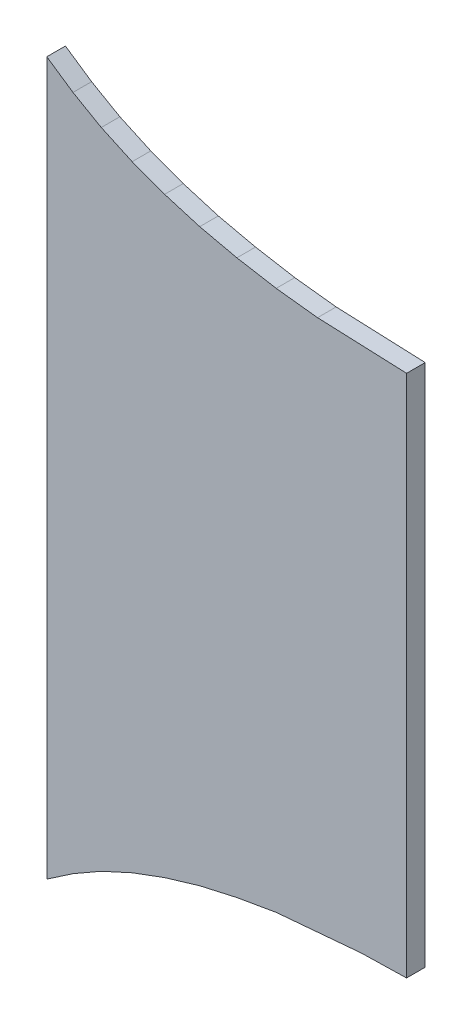
ISO-10303-21;
HEADER;
FILE_DESCRIPTION(('STEP AP214'),'2;1');
FILE_NAME('part.step','',(''),(''),'','','');
FILE_SCHEMA(('AUTOMOTIVE_DESIGN { 1 0 10303 214 1 1 1 1 }'));
ENDSEC;
DATA;
#1=APPLICATION_CONTEXT('core data for automotive mechanical design processes');
#2=APPLICATION_PROTOCOL_DEFINITION('international standard','automotive_design',2000,#1);
#3=PRODUCT_CONTEXT('',#1,'mechanical');
#4=PRODUCT('Part','Part','',(#3));
#5=PRODUCT_RELATED_PRODUCT_CATEGORY('part','',(#4));
#6=PRODUCT_DEFINITION_FORMATION('','',#4);
#7=PRODUCT_DEFINITION_CONTEXT('part definition',#1,'design');
#8=PRODUCT_DEFINITION('design','',#6,#7);
#9=PRODUCT_DEFINITION_SHAPE('','',#8);
#10=(LENGTH_UNIT() NAMED_UNIT(*) SI_UNIT(.MILLI.,.METRE.));
#11=(NAMED_UNIT(*) PLANE_ANGLE_UNIT() SI_UNIT($,.RADIAN.));
#12=(NAMED_UNIT(*) SI_UNIT($,.STERADIAN.) SOLID_ANGLE_UNIT());
#13=UNCERTAINTY_MEASURE_WITH_UNIT(LENGTH_MEASURE(1.E-05),#10,'distance_accuracy_value','');
#14=(GEOMETRIC_REPRESENTATION_CONTEXT(3) GLOBAL_UNCERTAINTY_ASSIGNED_CONTEXT((#13)) GLOBAL_UNIT_ASSIGNED_CONTEXT((#10,
#11,#12)) REPRESENTATION_CONTEXT('',''));
#15=CARTESIAN_POINT('',(0.,0.,0.));
#16=DIRECTION('',(0.,0.,1.));
#17=DIRECTION('',(1.,0.,0.));
#18=AXIS2_PLACEMENT_3D('',#15,#16,#17);
#19=CARTESIAN_POINT('',(51.0970001220703,49.,0.));
#20=DIRECTION('',(-0.0411409492265821,-0.999153352742579,0.));
#21=DIRECTION('',(-0.999153352742579,0.0411409492265821,0.));
#22=AXIS2_PLACEMENT_3D('',#19,#20,#21);
#23=PLANE('',#22);
#24=DIRECTION('',(-0.999153352742579,0.0411409492265821,0.));
#25=VECTOR('',#24,1.);
#26=CARTESIAN_POINT('',(51.0970001220703,49.,0.03556));
#27=LINE('',#26,#25);
#28=CARTESIAN_POINT('',(51.0970001220703,49.,0.03556));
#29=VERTEX_POINT('',#28);
#30=CARTESIAN_POINT('',(50.9269981384277,49.0069999694824,0.03556));
#31=VERTEX_POINT('',#30);
#32=EDGE_CURVE('E11',#29,#31,#27,.T.);
#33=ORIENTED_EDGE('',*,*,#32,.F.);
#34=DIRECTION('',(0.,0.,1.));
#35=VECTOR('',#34,1.);
#36=CARTESIAN_POINT('',(51.0970001220703,49.,0.));
#37=LINE('',#36,#35);
#38=CARTESIAN_POINT('',(51.0970001220703,49.,0.));
#39=VERTEX_POINT('',#38);
#40=EDGE_CURVE('E24',#39,#29,#37,.T.);
#41=ORIENTED_EDGE('',*,*,#40,.F.);
#42=DIRECTION('',(-0.999153352742579,0.0411409492265821,0.));
#43=VECTOR('',#42,1.);
#44=CARTESIAN_POINT('',(51.0970001220703,49.,0.));
#45=LINE('',#44,#43);
#46=CARTESIAN_POINT('',(50.9269981384277,49.0069999694824,0.));
#47=VERTEX_POINT('',#46);
#48=EDGE_CURVE('E172',#39,#47,#45,.T.);
#49=ORIENTED_EDGE('',*,*,#48,.T.);
#50=DIRECTION('',(0.,0.,1.));
#51=VECTOR('',#50,1.);
#52=CARTESIAN_POINT('',(50.9269981384277,49.0069999694824,0.));
#53=LINE('',#52,#51);
#54=EDGE_CURVE('E37',#47,#31,#53,.T.);
#55=ORIENTED_EDGE('',*,*,#54,.T.);
#56=EDGE_LOOP('',(#33,#41,#49,#55));
#57=FACE_BOUND('',#56,.T.);
#58=ADVANCED_FACE('F17',(#57),#23,.F.);
#59=CARTESIAN_POINT('',(50.9269981384277,49.0069999694824,0.));
#60=DIRECTION('',(-0.113179886839581,-0.993574513166969,0.));
#61=DIRECTION('',(-0.993574513166969,0.113179886839581,0.));
#62=AXIS2_PLACEMENT_3D('',#59,#60,#61);
#63=PLANE('',#62);
#64=DIRECTION('',(-0.993574513166969,0.113179886839581,0.));
#65=VECTOR('',#64,1.);
#66=CARTESIAN_POINT('',(50.9269981384277,49.0069999694824,0.03556));
#67=LINE('',#66,#65);
#68=CARTESIAN_POINT('',(50.8479995727539,49.015998840332,0.03556));
#69=VERTEX_POINT('',#68);
#70=EDGE_CURVE('E308',#31,#69,#67,.T.);
#71=ORIENTED_EDGE('',*,*,#70,.F.);
#72=ORIENTED_EDGE('',*,*,#54,.F.);
#73=DIRECTION('',(-0.993574513166969,0.113179886839581,0.));
#74=VECTOR('',#73,1.);
#75=CARTESIAN_POINT('',(50.9269981384277,49.0069999694824,0.));
#76=LINE('',#75,#74);
#77=CARTESIAN_POINT('',(50.8479995727539,49.015998840332,0.));
#78=VERTEX_POINT('',#77);
#79=EDGE_CURVE('E305',#47,#78,#76,.T.);
#80=ORIENTED_EDGE('',*,*,#79,.T.);
#81=DIRECTION('',(0.,0.,1.));
#82=VECTOR('',#81,1.);
#83=CARTESIAN_POINT('',(50.8479995727539,49.015998840332,0.));
#84=LINE('',#83,#82);
#85=EDGE_CURVE('E303',#78,#69,#84,.T.);
#86=ORIENTED_EDGE('',*,*,#85,.T.);
#87=EDGE_LOOP('',(#71,#72,#80,#86));
#88=FACE_BOUND('',#87,.T.);
#89=ADVANCED_FACE('F316',(#88),#63,.F.);
#90=CARTESIAN_POINT('',(50.8479995727539,49.015998840332,0.));
#91=DIRECTION('',(-0.170791264485801,-0.985307233290886,0.));
#92=DIRECTION('',(-0.985307233290886,0.170791264485801,0.));
#93=AXIS2_PLACEMENT_3D('',#90,#91,#92);
#94=PLANE('',#93);
#95=DIRECTION('',(-0.985307233290886,0.170791264485801,0.));
#96=VECTOR('',#95,1.);
#97=CARTESIAN_POINT('',(50.8479995727539,49.015998840332,0.03556));
#98=LINE('',#97,#96);
#99=CARTESIAN_POINT('',(50.7729988098144,49.0289993286133,0.03556));
#100=VERTEX_POINT('',#99);
#101=EDGE_CURVE('E300',#69,#100,#98,.T.);
#102=ORIENTED_EDGE('',*,*,#101,.F.);
#103=ORIENTED_EDGE('',*,*,#85,.F.);
#104=DIRECTION('',(-0.985307233290886,0.170791264485801,0.));
#105=VECTOR('',#104,1.);
#106=CARTESIAN_POINT('',(50.8479995727539,49.015998840332,0.));
#107=LINE('',#106,#105);
#108=CARTESIAN_POINT('',(50.7729988098144,49.0289993286133,0.));
#109=VERTEX_POINT('',#108);
#110=EDGE_CURVE('E297',#78,#109,#107,.T.);
#111=ORIENTED_EDGE('',*,*,#110,.T.);
#112=DIRECTION('',(0.,0.,1.));
#113=VECTOR('',#112,1.);
#114=CARTESIAN_POINT('',(50.7729988098144,49.0289993286133,0.));
#115=LINE('',#114,#113);
#116=EDGE_CURVE('E295',#109,#100,#115,.T.);
#117=ORIENTED_EDGE('',*,*,#116,.T.);
#118=EDGE_LOOP('',(#102,#103,#111,#117));
#119=FACE_BOUND('',#118,.T.);
#120=ADVANCED_FACE('F322',(#119),#94,.F.);
#121=CARTESIAN_POINT('',(50.7729988098144,49.0289993286133,0.));
#122=DIRECTION('',(-0.219826483748733,-0.975538987966482,0.));
#123=DIRECTION('',(-0.975538987966482,0.219826483748733,0.));
#124=AXIS2_PLACEMENT_3D('',#121,#122,#123);
#125=PLANE('',#124);
#126=DIRECTION('',(-0.975538987966482,0.219826483748733,0.));
#127=VECTOR('',#126,1.);
#128=CARTESIAN_POINT('',(50.7729988098144,49.0289993286133,0.03556));
#129=LINE('',#128,#127);
#130=CARTESIAN_POINT('',(50.7019996643066,49.0449981689453,0.03556));
#131=VERTEX_POINT('',#130);
#132=EDGE_CURVE('E292',#100,#131,#129,.T.);
#133=ORIENTED_EDGE('',*,*,#132,.F.);
#134=ORIENTED_EDGE('',*,*,#116,.F.);
#135=DIRECTION('',(-0.975538987966482,0.219826483748733,0.));
#136=VECTOR('',#135,1.);
#137=CARTESIAN_POINT('',(50.7729988098144,49.0289993286133,0.));
#138=LINE('',#137,#136);
#139=CARTESIAN_POINT('',(50.7019996643066,49.0449981689453,0.));
#140=VERTEX_POINT('',#139);
#141=EDGE_CURVE('E289',#109,#140,#138,.T.);
#142=ORIENTED_EDGE('',*,*,#141,.T.);
#143=DIRECTION('',(0.,0.,1.));
#144=VECTOR('',#143,1.);
#145=CARTESIAN_POINT('',(50.7019996643066,49.0449981689453,0.));
#146=LINE('',#145,#144);
#147=EDGE_CURVE('E287',#140,#131,#146,.T.);
#148=ORIENTED_EDGE('',*,*,#147,.T.);
#149=EDGE_LOOP('',(#133,#134,#142,#148));
#150=FACE_BOUND('',#149,.T.);
#151=ADVANCED_FACE('F324',(#150),#125,.F.);
#152=CARTESIAN_POINT('',(50.7019996643066,49.0449981689453,0.));
#153=DIRECTION('',(-0.28603627403436,-0.958218790223058,0.));
#154=DIRECTION('',(-0.958218790223058,0.28603627403436,0.));
#155=AXIS2_PLACEMENT_3D('',#152,#153,#154);
#156=PLANE('',#155);
#157=DIRECTION('',(-0.958218790223058,0.28603627403436,0.));
#158=VECTOR('',#157,1.);
#159=CARTESIAN_POINT('',(50.7019996643066,49.0449981689453,0.03556));
#160=LINE('',#159,#158);
#161=CARTESIAN_POINT('',(50.6349983215332,49.064998626709,0.03556));
#162=VERTEX_POINT('',#161);
#163=EDGE_CURVE('E284',#131,#162,#160,.T.);
#164=ORIENTED_EDGE('',*,*,#163,.F.);
#165=ORIENTED_EDGE('',*,*,#147,.F.);
#166=DIRECTION('',(-0.958218790223058,0.28603627403436,0.));
#167=VECTOR('',#166,1.);
#168=CARTESIAN_POINT('',(50.7019996643066,49.0449981689453,0.));
#169=LINE('',#168,#167);
#170=CARTESIAN_POINT('',(50.6349983215332,49.064998626709,0.));
#171=VERTEX_POINT('',#170);
#172=EDGE_CURVE('E281',#140,#171,#169,.T.);
#173=ORIENTED_EDGE('',*,*,#172,.T.);
#174=DIRECTION('',(0.,0.,1.));
#175=VECTOR('',#174,1.);
#176=CARTESIAN_POINT('',(50.6349983215332,49.064998626709,0.));
#177=LINE('',#176,#175);
#178=EDGE_CURVE('E279',#171,#162,#177,.T.);
#179=ORIENTED_EDGE('',*,*,#178,.T.);
#180=EDGE_LOOP('',(#164,#165,#173,#179));
#181=FACE_BOUND('',#180,.T.);
#182=ADVANCED_FACE('F329',(#181),#156,.F.);
#183=CARTESIAN_POINT('',(50.6349983215332,49.064998626709,0.));
#184=DIRECTION('',(-0.347859167792918,-0.93754679850257,0.));
#185=DIRECTION('',(-0.93754679850257,0.347859167792918,0.));
#186=AXIS2_PLACEMENT_3D('',#183,#184,#185);
#187=PLANE('',#186);
#188=DIRECTION('',(-0.93754679850257,0.347859167792918,0.));
#189=VECTOR('',#188,1.);
#190=CARTESIAN_POINT('',(50.6349983215332,49.064998626709,0.03556));
#191=LINE('',#190,#189);
#192=CARTESIAN_POINT('',(50.5730018615723,49.0880012512207,0.03556));
#193=VERTEX_POINT('',#192);
#194=EDGE_CURVE('E276',#162,#193,#191,.T.);
#195=ORIENTED_EDGE('',*,*,#194,.F.);
#196=ORIENTED_EDGE('',*,*,#178,.F.);
#197=DIRECTION('',(-0.93754679850257,0.347859167792918,0.));
#198=VECTOR('',#197,1.);
#199=CARTESIAN_POINT('',(50.6349983215332,49.064998626709,0.));
#200=LINE('',#199,#198);
#201=CARTESIAN_POINT('',(50.5730018615723,49.0880012512207,0.));
#202=VERTEX_POINT('',#201);
#203=EDGE_CURVE('E273',#171,#202,#200,.T.);
#204=ORIENTED_EDGE('',*,*,#203,.T.);
#205=DIRECTION('',(0.,0.,1.));
#206=VECTOR('',#205,1.);
#207=CARTESIAN_POINT('',(50.5730018615723,49.0880012512207,0.));
#208=LINE('',#207,#206);
#209=EDGE_CURVE('E271',#202,#193,#208,.T.);
#210=ORIENTED_EDGE('',*,*,#209,.T.);
#211=EDGE_LOOP('',(#195,#196,#204,#210));
#212=FACE_BOUND('',#211,.T.);
#213=ADVANCED_FACE('F332',(#212),#187,.F.);
#214=CARTESIAN_POINT('',(50.5730018615723,49.0880012512207,0.));
#215=DIRECTION('',(-0.416118186431333,-0.909310538221733,0.));
#216=DIRECTION('',(-0.909310538221733,0.416118186431333,0.));
#217=AXIS2_PLACEMENT_3D('',#214,#215,#216);
#218=PLANE('',#217);
#219=DIRECTION('',(-0.909310538221733,0.416118186431333,0.));
#220=VECTOR('',#219,1.);
#221=CARTESIAN_POINT('',(50.5730018615723,49.0880012512207,0.03556));
#222=LINE('',#221,#220);
#223=CARTESIAN_POINT('',(50.5139999389648,49.1150016784668,0.03556));
#224=VERTEX_POINT('',#223);
#225=EDGE_CURVE('E268',#193,#224,#222,.T.);
#226=ORIENTED_EDGE('',*,*,#225,.F.);
#227=ORIENTED_EDGE('',*,*,#209,.F.);
#228=DIRECTION('',(-0.909310538221733,0.416118186431333,0.));
#229=VECTOR('',#228,1.);
#230=CARTESIAN_POINT('',(50.5730018615723,49.0880012512207,0.));
#231=LINE('',#230,#229);
#232=CARTESIAN_POINT('',(50.5139999389648,49.1150016784668,0.));
#233=VERTEX_POINT('',#232);
#234=EDGE_CURVE('E265',#202,#233,#231,.T.);
#235=ORIENTED_EDGE('',*,*,#234,.T.);
#236=DIRECTION('',(0.,0.,1.));
#237=VECTOR('',#236,1.);
#238=CARTESIAN_POINT('',(50.5139999389648,49.1150016784668,0.));
#239=LINE('',#238,#237);
#240=EDGE_CURVE('E263',#233,#224,#239,.T.);
#241=ORIENTED_EDGE('',*,*,#240,.T.);
#242=EDGE_LOOP('',(#226,#227,#235,#241));
#243=FACE_BOUND('',#242,.T.);
#244=ADVANCED_FACE('F337',(#243),#218,.F.);
#245=CARTESIAN_POINT('',(50.5139999389649,49.1150016784668,0.));
#246=DIRECTION('',(-0.497840212117515,-0.867268772180106,0.));
#247=DIRECTION('',(-0.867268772180106,0.497840212117515,0.));
#248=AXIS2_PLACEMENT_3D('',#245,#246,#247);
#249=PLANE('',#248);
#250=DIRECTION('',(-0.867268772180106,0.497840212117515,0.));
#251=VECTOR('',#250,1.);
#252=CARTESIAN_POINT('',(50.5139999389648,49.1150016784668,0.03556));
#253=LINE('',#252,#251);
#254=CARTESIAN_POINT('',(50.4599990844727,49.1459999084473,0.03556));
#255=VERTEX_POINT('',#254);
#256=EDGE_CURVE('E260',#224,#255,#253,.T.);
#257=ORIENTED_EDGE('',*,*,#256,.F.);
#258=ORIENTED_EDGE('',*,*,#240,.F.);
#259=DIRECTION('',(-0.867268772180106,0.497840212117515,0.));
#260=VECTOR('',#259,1.);
#261=CARTESIAN_POINT('',(50.5139999389648,49.1150016784668,0.));
#262=LINE('',#261,#260);
#263=CARTESIAN_POINT('',(50.4599990844727,49.1459999084473,0.));
#264=VERTEX_POINT('',#263);
#265=EDGE_CURVE('E257',#233,#264,#262,.T.);
#266=ORIENTED_EDGE('',*,*,#265,.T.);
#267=DIRECTION('',(0.,0.,1.));
#268=VECTOR('',#267,1.);
#269=CARTESIAN_POINT('',(50.4599990844727,49.1459999084473,0.));
#270=LINE('',#269,#268);
#271=EDGE_CURVE('E255',#264,#255,#270,.T.);
#272=ORIENTED_EDGE('',*,*,#271,.T.);
#273=EDGE_LOOP('',(#257,#258,#266,#272));
#274=FACE_BOUND('',#273,.T.);
#275=ADVANCED_FACE('F340',(#274),#249,.F.);
#276=CARTESIAN_POINT('',(50.4599990844727,49.1459999084473,0.));
#277=DIRECTION('',(-0.562320375287299,-0.826919461336321,0.));
#278=DIRECTION('',(-0.826919461336321,0.562320375287299,0.));
#279=AXIS2_PLACEMENT_3D('',#276,#277,#278);
#280=PLANE('',#279);
#281=DIRECTION('',(-0.826919461336321,0.562320375287299,0.));
#282=VECTOR('',#281,1.);
#283=CARTESIAN_POINT('',(50.4599990844727,49.1459999084473,0.03556));
#284=LINE('',#283,#282);
#285=CARTESIAN_POINT('',(50.4099998474121,49.1800003051758,0.03556));
#286=VERTEX_POINT('',#285);
#287=EDGE_CURVE('E252',#255,#286,#284,.T.);
#288=ORIENTED_EDGE('',*,*,#287,.F.);
#289=ORIENTED_EDGE('',*,*,#271,.F.);
#290=DIRECTION('',(-0.826919461336321,0.562320375287299,0.));
#291=VECTOR('',#290,1.);
#292=CARTESIAN_POINT('',(50.4599990844727,49.1459999084473,0.));
#293=LINE('',#292,#291);
#294=CARTESIAN_POINT('',(50.4099998474121,49.1800003051758,0.));
#295=VERTEX_POINT('',#294);
#296=EDGE_CURVE('E249',#264,#295,#293,.T.);
#297=ORIENTED_EDGE('',*,*,#296,.T.);
#298=DIRECTION('',(0.,0.,1.));
#299=VECTOR('',#298,1.);
#300=CARTESIAN_POINT('',(50.4099998474121,49.1800003051758,0.));
#301=LINE('',#300,#299);
#302=EDGE_CURVE('E247',#295,#286,#301,.T.);
#303=ORIENTED_EDGE('',*,*,#302,.T.);
#304=EDGE_LOOP('',(#288,#289,#297,#303));
#305=FACE_BOUND('',#304,.T.);
#306=ADVANCED_FACE('F345',(#305),#280,.F.);
#307=CARTESIAN_POINT('',(50.4099998474121,49.1800003051758,0.));
#308=DIRECTION('',(1.,0.,0.));
#309=DIRECTION('',(0.,-1.,0.));
#310=AXIS2_PLACEMENT_3D('',#307,#308,#309);
#311=PLANE('',#310);
#312=DIRECTION('',(0.,-1.,0.));
#313=VECTOR('',#312,1.);
#314=CARTESIAN_POINT('',(50.4099998474121,49.1800003051758,0.03556));
#315=LINE('',#314,#313);
#316=CARTESIAN_POINT('',(50.4099998474121,47.8199996948242,0.03556));
#317=VERTEX_POINT('',#316);
#318=EDGE_CURVE('E244',#286,#317,#315,.T.);
#319=ORIENTED_EDGE('',*,*,#318,.F.);
#320=ORIENTED_EDGE('',*,*,#302,.F.);
#321=DIRECTION('',(0.,-1.,0.));
#322=VECTOR('',#321,1.);
#323=CARTESIAN_POINT('',(50.4099998474121,49.1800003051758,0.));
#324=LINE('',#323,#322);
#325=CARTESIAN_POINT('',(50.4099998474121,47.8199996948242,0.));
#326=VERTEX_POINT('',#325);
#327=EDGE_CURVE('E241',#295,#326,#324,.T.);
#328=ORIENTED_EDGE('',*,*,#327,.T.);
#329=DIRECTION('',(0.,0.,1.));
#330=VECTOR('',#329,1.);
#331=CARTESIAN_POINT('',(50.4099998474121,47.8199996948242,0.));
#332=LINE('',#331,#330);
#333=EDGE_CURVE('E239',#326,#317,#332,.T.);
#334=ORIENTED_EDGE('',*,*,#333,.T.);
#335=EDGE_LOOP('',(#319,#320,#328,#334));
#336=FACE_BOUND('',#335,.T.);
#337=ADVANCED_FACE('F348',(#336),#311,.F.);
#338=CARTESIAN_POINT('',(50.4099998474121,47.8199996948242,0.));
#339=DIRECTION('',(-0.562320375287299,0.826919461336321,0.));
#340=DIRECTION('',(0.826919461336321,0.562320375287299,0.));
#341=AXIS2_PLACEMENT_3D('',#338,#339,#340);
#342=PLANE('',#341);
#343=DIRECTION('',(0.826919461336321,0.562320375287299,0.));
#344=VECTOR('',#343,1.);
#345=CARTESIAN_POINT('',(50.4099998474121,47.8199996948242,0.03556));
#346=LINE('',#345,#344);
#347=CARTESIAN_POINT('',(50.4599990844727,47.8540000915527,0.03556));
#348=VERTEX_POINT('',#347);
#349=EDGE_CURVE('E236',#317,#348,#346,.T.);
#350=ORIENTED_EDGE('',*,*,#349,.F.);
#351=ORIENTED_EDGE('',*,*,#333,.F.);
#352=DIRECTION('',(0.826919461336321,0.562320375287299,0.));
#353=VECTOR('',#352,1.);
#354=CARTESIAN_POINT('',(50.4099998474121,47.8199996948242,0.));
#355=LINE('',#354,#353);
#356=CARTESIAN_POINT('',(50.4599990844727,47.8540000915527,0.));
#357=VERTEX_POINT('',#356);
#358=EDGE_CURVE('E233',#326,#357,#355,.T.);
#359=ORIENTED_EDGE('',*,*,#358,.T.);
#360=DIRECTION('',(0.,0.,1.));
#361=VECTOR('',#360,1.);
#362=CARTESIAN_POINT('',(50.4599990844727,47.8540000915527,0.));
#363=LINE('',#362,#361);
#364=EDGE_CURVE('E231',#357,#348,#363,.T.);
#365=ORIENTED_EDGE('',*,*,#364,.T.);
#366=EDGE_LOOP('',(#350,#351,#359,#365));
#367=FACE_BOUND('',#366,.T.);
#368=ADVANCED_FACE('F353',(#367),#342,.F.);
#369=CARTESIAN_POINT('',(50.4599990844727,47.8540000915527,0.));
#370=DIRECTION('',(-0.497840212117515,0.867268772180106,0.));
#371=DIRECTION('',(0.867268772180106,0.497840212117515,0.));
#372=AXIS2_PLACEMENT_3D('',#369,#370,#371);
#373=PLANE('',#372);
#374=DIRECTION('',(0.867268772180106,0.497840212117515,0.));
#375=VECTOR('',#374,1.);
#376=CARTESIAN_POINT('',(50.4599990844727,47.8540000915527,0.03556));
#377=LINE('',#376,#375);
#378=CARTESIAN_POINT('',(50.5139999389648,47.8849983215332,0.03556));
#379=VERTEX_POINT('',#378);
#380=EDGE_CURVE('E228',#348,#379,#377,.T.);
#381=ORIENTED_EDGE('',*,*,#380,.F.);
#382=ORIENTED_EDGE('',*,*,#364,.F.);
#383=DIRECTION('',(0.867268772180106,0.497840212117515,0.));
#384=VECTOR('',#383,1.);
#385=CARTESIAN_POINT('',(50.4599990844727,47.8540000915527,0.));
#386=LINE('',#385,#384);
#387=CARTESIAN_POINT('',(50.5139999389648,47.8849983215332,0.));
#388=VERTEX_POINT('',#387);
#389=EDGE_CURVE('E225',#357,#388,#386,.T.);
#390=ORIENTED_EDGE('',*,*,#389,.T.);
#391=DIRECTION('',(0.,0.,1.));
#392=VECTOR('',#391,1.);
#393=CARTESIAN_POINT('',(50.5139999389648,47.8849983215332,0.));
#394=LINE('',#393,#392);
#395=EDGE_CURVE('E223',#388,#379,#394,.T.);
#396=ORIENTED_EDGE('',*,*,#395,.T.);
#397=EDGE_LOOP('',(#381,#382,#390,#396));
#398=FACE_BOUND('',#397,.T.);
#399=ADVANCED_FACE('F356',(#398),#373,.F.);
#400=CARTESIAN_POINT('',(50.5139999389649,47.8849983215332,0.));
#401=DIRECTION('',(-0.416118186431333,0.909310538221733,0.));
#402=DIRECTION('',(0.909310538221733,0.416118186431333,0.));
#403=AXIS2_PLACEMENT_3D('',#400,#401,#402);
#404=PLANE('',#403);
#405=DIRECTION('',(0.909310538221733,0.416118186431333,0.));
#406=VECTOR('',#405,1.);
#407=CARTESIAN_POINT('',(50.5139999389648,47.8849983215332,0.03556));
#408=LINE('',#407,#406);
#409=CARTESIAN_POINT('',(50.5730018615723,47.9119987487793,0.03556));
#410=VERTEX_POINT('',#409);
#411=EDGE_CURVE('E220',#379,#410,#408,.T.);
#412=ORIENTED_EDGE('',*,*,#411,.F.);
#413=ORIENTED_EDGE('',*,*,#395,.F.);
#414=DIRECTION('',(0.909310538221733,0.416118186431333,0.));
#415=VECTOR('',#414,1.);
#416=CARTESIAN_POINT('',(50.5139999389648,47.8849983215332,0.));
#417=LINE('',#416,#415);
#418=CARTESIAN_POINT('',(50.5730018615723,47.9119987487793,0.));
#419=VERTEX_POINT('',#418);
#420=EDGE_CURVE('E217',#388,#419,#417,.T.);
#421=ORIENTED_EDGE('',*,*,#420,.T.);
#422=DIRECTION('',(0.,0.,1.));
#423=VECTOR('',#422,1.);
#424=CARTESIAN_POINT('',(50.5730018615723,47.9119987487793,0.));
#425=LINE('',#424,#423);
#426=EDGE_CURVE('E215',#419,#410,#425,.T.);
#427=ORIENTED_EDGE('',*,*,#426,.T.);
#428=EDGE_LOOP('',(#412,#413,#421,#427));
#429=FACE_BOUND('',#428,.T.);
#430=ADVANCED_FACE('F361',(#429),#404,.F.);
#431=CARTESIAN_POINT('',(50.5730018615723,47.9119987487793,0.));
#432=DIRECTION('',(-0.347859167792918,0.93754679850257,0.));
#433=DIRECTION('',(0.93754679850257,0.347859167792918,0.));
#434=AXIS2_PLACEMENT_3D('',#431,#432,#433);
#435=PLANE('',#434);
#436=DIRECTION('',(0.93754679850257,0.347859167792918,0.));
#437=VECTOR('',#436,1.);
#438=CARTESIAN_POINT('',(50.5730018615723,47.9119987487793,0.03556));
#439=LINE('',#438,#437);
#440=CARTESIAN_POINT('',(50.6349983215332,47.935001373291,0.03556));
#441=VERTEX_POINT('',#440);
#442=EDGE_CURVE('E212',#410,#441,#439,.T.);
#443=ORIENTED_EDGE('',*,*,#442,.F.);
#444=ORIENTED_EDGE('',*,*,#426,.F.);
#445=DIRECTION('',(0.93754679850257,0.347859167792918,0.));
#446=VECTOR('',#445,1.);
#447=CARTESIAN_POINT('',(50.5730018615723,47.9119987487793,0.));
#448=LINE('',#447,#446);
#449=CARTESIAN_POINT('',(50.6349983215332,47.935001373291,0.));
#450=VERTEX_POINT('',#449);
#451=EDGE_CURVE('E209',#419,#450,#448,.T.);
#452=ORIENTED_EDGE('',*,*,#451,.T.);
#453=DIRECTION('',(0.,0.,1.));
#454=VECTOR('',#453,1.);
#455=CARTESIAN_POINT('',(50.6349983215332,47.935001373291,0.));
#456=LINE('',#455,#454);
#457=EDGE_CURVE('E207',#450,#441,#456,.T.);
#458=ORIENTED_EDGE('',*,*,#457,.T.);
#459=EDGE_LOOP('',(#443,#444,#452,#458));
#460=FACE_BOUND('',#459,.T.);
#461=ADVANCED_FACE('F364',(#460),#435,.F.);
#462=CARTESIAN_POINT('',(50.6349983215332,47.935001373291,0.));
#463=DIRECTION('',(-0.28603627403436,0.958218790223058,0.));
#464=DIRECTION('',(0.958218790223058,0.28603627403436,0.));
#465=AXIS2_PLACEMENT_3D('',#462,#463,#464);
#466=PLANE('',#465);
#467=DIRECTION('',(0.958218790223058,0.28603627403436,0.));
#468=VECTOR('',#467,1.);
#469=CARTESIAN_POINT('',(50.6349983215332,47.935001373291,0.03556));
#470=LINE('',#469,#468);
#471=CARTESIAN_POINT('',(50.7019996643066,47.9550018310547,0.03556));
#472=VERTEX_POINT('',#471);
#473=EDGE_CURVE('E204',#441,#472,#470,.T.);
#474=ORIENTED_EDGE('',*,*,#473,.F.);
#475=ORIENTED_EDGE('',*,*,#457,.F.);
#476=DIRECTION('',(0.958218790223058,0.28603627403436,0.));
#477=VECTOR('',#476,1.);
#478=CARTESIAN_POINT('',(50.6349983215332,47.935001373291,0.));
#479=LINE('',#478,#477);
#480=CARTESIAN_POINT('',(50.7019996643066,47.9550018310547,0.));
#481=VERTEX_POINT('',#480);
#482=EDGE_CURVE('E201',#450,#481,#479,.T.);
#483=ORIENTED_EDGE('',*,*,#482,.T.);
#484=DIRECTION('',(0.,0.,1.));
#485=VECTOR('',#484,1.);
#486=CARTESIAN_POINT('',(50.7019996643066,47.9550018310547,0.));
#487=LINE('',#486,#485);
#488=EDGE_CURVE('E199',#481,#472,#487,.T.);
#489=ORIENTED_EDGE('',*,*,#488,.T.);
#490=EDGE_LOOP('',(#474,#475,#483,#489));
#491=FACE_BOUND('',#490,.T.);
#492=ADVANCED_FACE('F369',(#491),#466,.F.);
#493=CARTESIAN_POINT('',(50.7019996643066,47.9550018310547,0.));
#494=DIRECTION('',(-0.219826483748733,0.975538987966482,0.));
#495=DIRECTION('',(0.975538987966482,0.219826483748733,0.));
#496=AXIS2_PLACEMENT_3D('',#493,#494,#495);
#497=PLANE('',#496);
#498=DIRECTION('',(0.975538987966482,0.219826483748733,0.));
#499=VECTOR('',#498,1.);
#500=CARTESIAN_POINT('',(50.7019996643066,47.9550018310547,0.03556));
#501=LINE('',#500,#499);
#502=CARTESIAN_POINT('',(50.7729988098144,47.9710006713867,0.03556));
#503=VERTEX_POINT('',#502);
#504=EDGE_CURVE('E196',#472,#503,#501,.T.);
#505=ORIENTED_EDGE('',*,*,#504,.F.);
#506=ORIENTED_EDGE('',*,*,#488,.F.);
#507=DIRECTION('',(0.975538987966482,0.219826483748733,0.));
#508=VECTOR('',#507,1.);
#509=CARTESIAN_POINT('',(50.7019996643066,47.9550018310547,0.));
#510=LINE('',#509,#508);
#511=CARTESIAN_POINT('',(50.7729988098144,47.9710006713867,0.));
#512=VERTEX_POINT('',#511);
#513=EDGE_CURVE('E193',#481,#512,#510,.T.);
#514=ORIENTED_EDGE('',*,*,#513,.T.);
#515=DIRECTION('',(0.,0.,1.));
#516=VECTOR('',#515,1.);
#517=CARTESIAN_POINT('',(50.7729988098144,47.9710006713867,0.));
#518=LINE('',#517,#516);
#519=EDGE_CURVE('E191',#512,#503,#518,.T.);
#520=ORIENTED_EDGE('',*,*,#519,.T.);
#521=EDGE_LOOP('',(#505,#506,#514,#520));
#522=FACE_BOUND('',#521,.T.);
#523=ADVANCED_FACE('F372',(#522),#497,.F.);
#524=CARTESIAN_POINT('',(50.7729988098144,47.9710006713867,0.));
#525=DIRECTION('',(-0.170791264485801,0.985307233290886,0.));
#526=DIRECTION('',(0.985307233290886,0.170791264485801,0.));
#527=AXIS2_PLACEMENT_3D('',#524,#525,#526);
#528=PLANE('',#527);
#529=DIRECTION('',(0.985307233290886,0.170791264485801,0.));
#530=VECTOR('',#529,1.);
#531=CARTESIAN_POINT('',(50.7729988098144,47.9710006713867,0.03556));
#532=LINE('',#531,#530);
#533=CARTESIAN_POINT('',(50.8479995727539,47.984001159668,0.03556));
#534=VERTEX_POINT('',#533);
#535=EDGE_CURVE('E188',#503,#534,#532,.T.);
#536=ORIENTED_EDGE('',*,*,#535,.F.);
#537=ORIENTED_EDGE('',*,*,#519,.F.);
#538=DIRECTION('',(0.985307233290886,0.170791264485801,0.));
#539=VECTOR('',#538,1.);
#540=CARTESIAN_POINT('',(50.7729988098144,47.9710006713867,0.));
#541=LINE('',#540,#539);
#542=CARTESIAN_POINT('',(50.8479995727539,47.984001159668,0.));
#543=VERTEX_POINT('',#542);
#544=EDGE_CURVE('E185',#512,#543,#541,.T.);
#545=ORIENTED_EDGE('',*,*,#544,.T.);
#546=DIRECTION('',(0.,0.,1.));
#547=VECTOR('',#546,1.);
#548=CARTESIAN_POINT('',(50.8479995727539,47.984001159668,0.));
#549=LINE('',#548,#547);
#550=EDGE_CURVE('E183',#543,#534,#549,.T.);
#551=ORIENTED_EDGE('',*,*,#550,.T.);
#552=EDGE_LOOP('',(#536,#537,#545,#551));
#553=FACE_BOUND('',#552,.T.);
#554=ADVANCED_FACE('F377',(#553),#528,.F.);
#555=CARTESIAN_POINT('',(50.8479995727539,47.984001159668,0.));
#556=DIRECTION('',(-0.086099129464065,0.996286575190859,0.));
#557=DIRECTION('',(0.996286575190859,0.086099129464065,0.));
#558=AXIS2_PLACEMENT_3D('',#555,#556,#557);
#559=PLANE('',#558);
#560=DIRECTION('',(0.996286575190859,0.086099129464065,0.));
#561=VECTOR('',#560,1.);
#562=CARTESIAN_POINT('',(50.8479995727539,47.984001159668,0.03556));
#563=LINE('',#562,#561);
#564=CARTESIAN_POINT('',(51.0099983215332,47.9980010986328,0.03556));
#565=VERTEX_POINT('',#564);
#566=EDGE_CURVE('E180',#534,#565,#563,.T.);
#567=ORIENTED_EDGE('',*,*,#566,.F.);
#568=ORIENTED_EDGE('',*,*,#550,.F.);
#569=DIRECTION('',(0.996286575190859,0.086099129464065,0.));
#570=VECTOR('',#569,1.);
#571=CARTESIAN_POINT('',(50.8479995727539,47.984001159668,0.));
#572=LINE('',#571,#570);
#573=CARTESIAN_POINT('',(51.0099983215332,47.9980010986328,0.));
#574=VERTEX_POINT('',#573);
#575=EDGE_CURVE('E178',#543,#574,#572,.T.);
#576=ORIENTED_EDGE('',*,*,#575,.T.);
#577=DIRECTION('',(0.,0.,1.));
#578=VECTOR('',#577,1.);
#579=CARTESIAN_POINT('',(51.0099983215332,47.9980010986328,0.));
#580=LINE('',#579,#578);
#581=EDGE_CURVE('E163',#574,#565,#580,.T.);
#582=ORIENTED_EDGE('',*,*,#581,.T.);
#583=EDGE_LOOP('',(#567,#568,#576,#582));
#584=FACE_BOUND('',#583,.T.);
#585=ADVANCED_FACE('F379',(#584),#559,.F.);
#586=CARTESIAN_POINT('',(51.0099983215332,47.9980010986328,0.));
#587=DIRECTION('',(-0.0229693406858823,0.999736169891065,0.));
#588=DIRECTION('',(0.999736169891065,0.0229693406858823,0.));
#589=AXIS2_PLACEMENT_3D('',#586,#587,#588);
#590=PLANE('',#589);
#591=DIRECTION('',(0.999736169891065,0.0229693406858823,0.));
#592=VECTOR('',#591,1.);
#593=CARTESIAN_POINT('',(51.0099983215332,47.9980010986328,0.03556));
#594=LINE('',#593,#592);
#595=CARTESIAN_POINT('',(51.0970001220703,48.,0.03556));
#596=VERTEX_POINT('',#595);
#597=EDGE_CURVE('E167',#565,#596,#594,.T.);
#598=ORIENTED_EDGE('',*,*,#597,.F.);
#599=ORIENTED_EDGE('',*,*,#581,.F.);
#600=DIRECTION('',(0.999736169891065,0.0229693406858823,0.));
#601=VECTOR('',#600,1.);
#602=CARTESIAN_POINT('',(51.0099983215332,47.9980010986328,0.));
#603=LINE('',#602,#601);
#604=CARTESIAN_POINT('',(51.0970001220703,48.,0.));
#605=VERTEX_POINT('',#604);
#606=EDGE_CURVE('E159',#574,#605,#603,.T.);
#607=ORIENTED_EDGE('',*,*,#606,.T.);
#608=DIRECTION('',(0.,0.,1.));
#609=VECTOR('',#608,1.);
#610=CARTESIAN_POINT('',(51.0970001220703,48.,0.));
#611=LINE('',#610,#609);
#612=EDGE_CURVE('E149',#605,#596,#611,.T.);
#613=ORIENTED_EDGE('',*,*,#612,.T.);
#614=EDGE_LOOP('',(#598,#599,#607,#613));
#615=FACE_BOUND('',#614,.T.);
#616=ADVANCED_FACE('F162',(#615),#590,.F.);
#617=CARTESIAN_POINT('',(51.0970001220703,48.,0.));
#618=DIRECTION('',(-1.,0.,0.));
#619=DIRECTION('',(0.,1.,0.));
#620=AXIS2_PLACEMENT_3D('',#617,#618,#619);
#621=PLANE('',#620);
#622=DIRECTION('',(0.,1.,0.));
#623=VECTOR('',#622,1.);
#624=CARTESIAN_POINT('',(51.0970001220703,48.,0.03556));
#625=LINE('',#624,#623);
#626=EDGE_CURVE('E155',#596,#29,#625,.T.);
#627=ORIENTED_EDGE('',*,*,#626,.F.);
#628=ORIENTED_EDGE('',*,*,#612,.F.);
#629=DIRECTION('',(0.,1.,0.));
#630=VECTOR('',#629,1.);
#631=CARTESIAN_POINT('',(51.0970001220703,48.,0.));
#632=LINE('',#631,#630);
#633=EDGE_CURVE('E153',#605,#39,#632,.T.);
#634=ORIENTED_EDGE('',*,*,#633,.T.);
#635=ORIENTED_EDGE('',*,*,#40,.T.);
#636=EDGE_LOOP('',(#627,#628,#634,#635));
#637=FACE_BOUND('',#636,.T.);
#638=ADVANCED_FACE('F151',(#637),#621,.F.);
#639=CARTESIAN_POINT('',(51.0970001220703,49.,0.));
#640=DIRECTION('',(0.,0.,1.));
#641=DIRECTION('',(1.,0.,0.));
#642=AXIS2_PLACEMENT_3D('',#639,#640,#641);
#643=PLANE('',#642);
#644=ORIENTED_EDGE('',*,*,#633,.F.);
#645=ORIENTED_EDGE('',*,*,#606,.F.);
#646=ORIENTED_EDGE('',*,*,#575,.F.);
#647=ORIENTED_EDGE('',*,*,#544,.F.);
#648=ORIENTED_EDGE('',*,*,#513,.F.);
#649=ORIENTED_EDGE('',*,*,#482,.F.);
#650=ORIENTED_EDGE('',*,*,#451,.F.);
#651=ORIENTED_EDGE('',*,*,#420,.F.);
#652=ORIENTED_EDGE('',*,*,#389,.F.);
#653=ORIENTED_EDGE('',*,*,#358,.F.);
#654=ORIENTED_EDGE('',*,*,#327,.F.);
#655=ORIENTED_EDGE('',*,*,#296,.F.);
#656=ORIENTED_EDGE('',*,*,#265,.F.);
#657=ORIENTED_EDGE('',*,*,#234,.F.);
#658=ORIENTED_EDGE('',*,*,#203,.F.);
#659=ORIENTED_EDGE('',*,*,#172,.F.);
#660=ORIENTED_EDGE('',*,*,#141,.F.);
#661=ORIENTED_EDGE('',*,*,#110,.F.);
#662=ORIENTED_EDGE('',*,*,#79,.F.);
#663=ORIENTED_EDGE('',*,*,#48,.F.);
#664=EDGE_LOOP('',(#644,#645,#646,#647,#648,#649,#650,#651,#652,#653,#654,#655,#656,#657,#658,
#659,#660,#661,#662,#663));
#665=FACE_BOUND('',#664,.T.);
#666=ADVANCED_FACE('F170',(#665),#643,.F.);
#667=CARTESIAN_POINT('',(51.0970001220703,49.,0.03556));
#668=DIRECTION('',(0.,0.,1.));
#669=DIRECTION('',(1.,0.,0.));
#670=AXIS2_PLACEMENT_3D('',#667,#668,#669);
#671=PLANE('',#670);
#672=ORIENTED_EDGE('',*,*,#32,.T.);
#673=ORIENTED_EDGE('',*,*,#70,.T.);
#674=ORIENTED_EDGE('',*,*,#101,.T.);
#675=ORIENTED_EDGE('',*,*,#132,.T.);
#676=ORIENTED_EDGE('',*,*,#163,.T.);
#677=ORIENTED_EDGE('',*,*,#194,.T.);
#678=ORIENTED_EDGE('',*,*,#225,.T.);
#679=ORIENTED_EDGE('',*,*,#256,.T.);
#680=ORIENTED_EDGE('',*,*,#287,.T.);
#681=ORIENTED_EDGE('',*,*,#318,.T.);
#682=ORIENTED_EDGE('',*,*,#349,.T.);
#683=ORIENTED_EDGE('',*,*,#380,.T.);
#684=ORIENTED_EDGE('',*,*,#411,.T.);
#685=ORIENTED_EDGE('',*,*,#442,.T.);
#686=ORIENTED_EDGE('',*,*,#473,.T.);
#687=ORIENTED_EDGE('',*,*,#504,.T.);
#688=ORIENTED_EDGE('',*,*,#535,.T.);
#689=ORIENTED_EDGE('',*,*,#566,.T.);
#690=ORIENTED_EDGE('',*,*,#597,.T.);
#691=ORIENTED_EDGE('',*,*,#626,.T.);
#692=EDGE_LOOP('',(#672,#673,#674,#675,#676,#677,#678,#679,#680,#681,#682,#683,#684,#685,#686,
#687,#688,#689,#690,#691));
#693=FACE_BOUND('',#692,.T.);
#694=ADVANCED_FACE('F319',(#693),#671,.T.);
#695=CLOSED_SHELL('',(#58,#89,#120,#151,#182,#213,#244,#275,#306,#337,#368,#399,#430,#461,#492,
#523,#554,#585,#616,#638,#666,#694));
#696=MANIFOLD_SOLID_BREP('B1',#695);
#697=ADVANCED_BREP_SHAPE_REPRESENTATION('',(#18,#696),#14);
#698=SHAPE_DEFINITION_REPRESENTATION(#9,#697);
ENDSEC;
END-ISO-10303-21;
